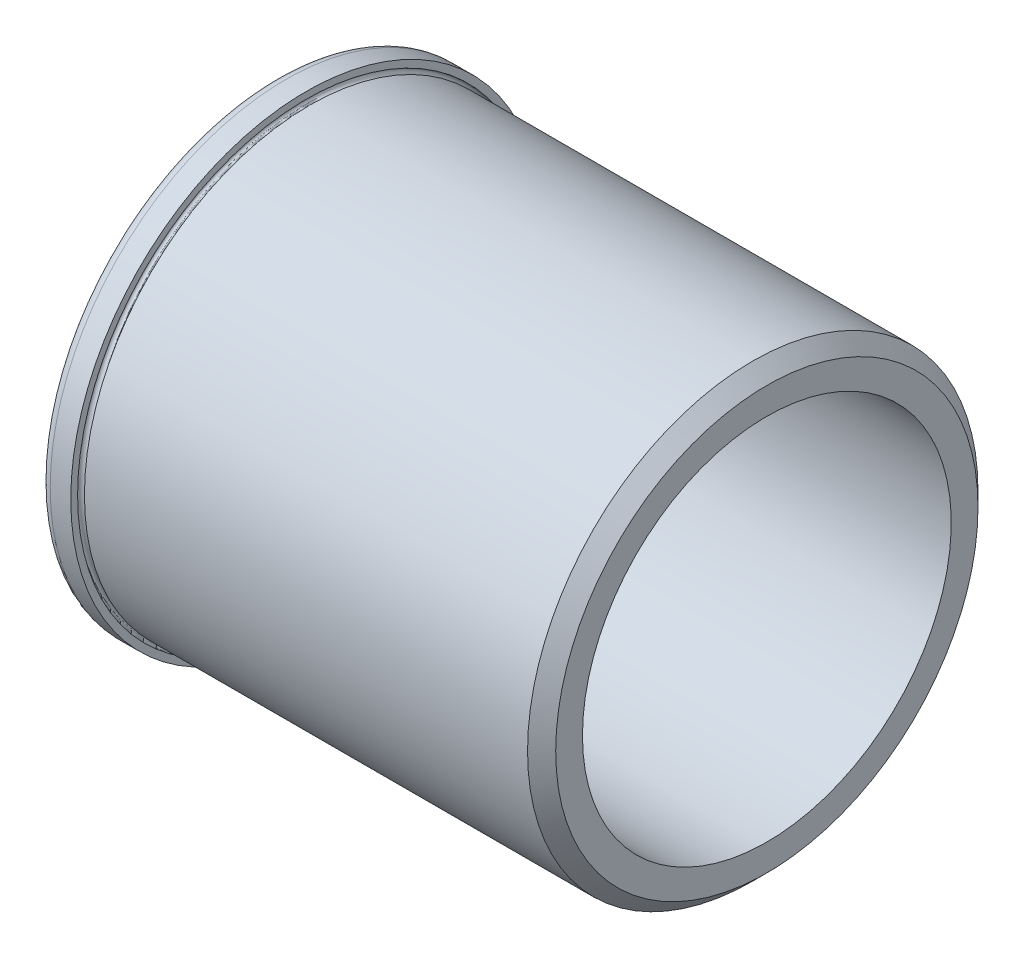
ISO-10303-21;
HEADER;
FILE_DESCRIPTION(('STEP AP214'),'2;1');
FILE_NAME('part.step','',(''),(''),'','','');
FILE_SCHEMA(('AUTOMOTIVE_DESIGN { 1 0 10303 214 1 1 1 1 }'));
ENDSEC;
DATA;
#1=APPLICATION_CONTEXT('core data for automotive mechanical design processes');
#2=APPLICATION_PROTOCOL_DEFINITION('international standard','automotive_design',2000,#1);
#3=PRODUCT_CONTEXT('',#1,'mechanical');
#4=PRODUCT('Part','Part','',(#3));
#5=PRODUCT_RELATED_PRODUCT_CATEGORY('part','',(#4));
#6=PRODUCT_DEFINITION_FORMATION('','',#4);
#7=PRODUCT_DEFINITION_CONTEXT('part definition',#1,'design');
#8=PRODUCT_DEFINITION('design','',#6,#7);
#9=PRODUCT_DEFINITION_SHAPE('','',#8);
#10=(LENGTH_UNIT() NAMED_UNIT(*) SI_UNIT(.MILLI.,.METRE.));
#11=(NAMED_UNIT(*) PLANE_ANGLE_UNIT() SI_UNIT($,.RADIAN.));
#12=(NAMED_UNIT(*) SI_UNIT($,.STERADIAN.) SOLID_ANGLE_UNIT());
#13=UNCERTAINTY_MEASURE_WITH_UNIT(LENGTH_MEASURE(1.E-05),#10,'distance_accuracy_value','');
#14=(GEOMETRIC_REPRESENTATION_CONTEXT(3) GLOBAL_UNCERTAINTY_ASSIGNED_CONTEXT((#13)) GLOBAL_UNIT_ASSIGNED_CONTEXT((#10,
#11,#12)) REPRESENTATION_CONTEXT('',''));
#15=CARTESIAN_POINT('',(0.,0.,0.));
#16=DIRECTION('',(0.,0.,1.));
#17=DIRECTION('',(1.,0.,0.));
#18=AXIS2_PLACEMENT_3D('',#15,#16,#17);
#19=CARTESIAN_POINT('',(4.7752,36.5125,0.));
#20=DIRECTION('',(1.,0.,0.));
#21=DIRECTION('',(0.,0.,-1.));
#22=AXIS2_PLACEMENT_3D('',#19,#20,#21);
#23=PLANE('',#22);
#24=CARTESIAN_POINT('',(4.7752,0.,0.));
#25=DIRECTION('',(-1.,0.,0.));
#26=DIRECTION('',(0.,0.,1.));
#27=AXIS2_PLACEMENT_3D('',#24,#25,#26);
#28=CIRCLE('',#27,35.4541666666667);
#29=CARTESIAN_POINT('',(4.7752,0.,35.4541666666667));
#30=VERTEX_POINT('',#29);
#31=EDGE_CURVE('E64',#30,#30,#28,.T.);
#32=ORIENTED_EDGE('',*,*,#31,.T.);
#33=EDGE_LOOP('',(#32));
#34=FACE_BOUND('',#33,.T.);
#35=CARTESIAN_POINT('',(4.7752,0.,0.));
#36=DIRECTION('',(-1.,0.,0.));
#37=DIRECTION('',(0.,0.,1.));
#38=AXIS2_PLACEMENT_3D('',#35,#36,#37);
#39=CIRCLE('',#38,36.5125);
#40=CARTESIAN_POINT('',(4.7752,0.,36.5125));
#41=VERTEX_POINT('',#40);
#42=EDGE_CURVE('E10',#41,#41,#39,.T.);
#43=ORIENTED_EDGE('',*,*,#42,.F.);
#44=EDGE_LOOP('',(#43));
#45=FACE_BOUND('',#44,.T.);
#46=ADVANCED_FACE('F30',(#34,#45),#23,.T.);
#47=CARTESIAN_POINT('',(0.,0.,0.));
#48=DIRECTION('',(-1.,0.,0.));
#49=DIRECTION('',(0.,0.,1.));
#50=AXIS2_PLACEMENT_3D('',#47,#48,#49);
#51=CYLINDRICAL_SURFACE('',#50,36.5125);
#52=ORIENTED_EDGE('',*,*,#42,.T.);
#53=EDGE_LOOP('',(#52));
#54=FACE_BOUND('',#53,.T.);
#55=CARTESIAN_POINT('',(1.58750000000001,0.,0.));
#56=DIRECTION('',(-1.,0.,0.));
#57=DIRECTION('',(0.,0.,1.));
#58=AXIS2_PLACEMENT_3D('',#55,#56,#57);
#59=CIRCLE('',#58,36.5125);
#60=CARTESIAN_POINT('',(1.58750000000001,0.,36.5125));
#61=VERTEX_POINT('',#60);
#62=EDGE_CURVE('E36',#61,#61,#59,.T.);
#63=ORIENTED_EDGE('',*,*,#62,.F.);
#64=EDGE_LOOP('',(#63));
#65=FACE_BOUND('',#64,.T.);
#66=ADVANCED_FACE('F82',(#54,#65),#51,.T.);
#67=CARTESIAN_POINT('',(1.5875,0.,0.));
#68=DIRECTION('',(-1.,0.,0.));
#69=DIRECTION('',(0.,0.,1.));
#70=AXIS2_PLACEMENT_3D('',#67,#68,#69);
#71=TOROIDAL_SURFACE('',#70,34.925,1.5875);
#72=CARTESIAN_POINT('',(0.,0.,0.));
#73=DIRECTION('',(-1.,0.,0.));
#74=DIRECTION('',(0.,0.,1.));
#75=AXIS2_PLACEMENT_3D('',#72,#73,#74);
#76=CIRCLE('',#75,34.925);
#77=CARTESIAN_POINT('',(0.,0.,34.925));
#78=VERTEX_POINT('',#77);
#79=EDGE_CURVE('E40',#78,#78,#76,.T.);
#80=ORIENTED_EDGE('',*,*,#79,.F.);
#81=EDGE_LOOP('',(#80));
#82=FACE_BOUND('',#81,.T.);
#83=ORIENTED_EDGE('',*,*,#62,.T.);
#84=EDGE_LOOP('',(#83));
#85=FACE_BOUND('',#84,.T.);
#86=ADVANCED_FACE('F86',(#82,#85),#71,.T.);
#87=CARTESIAN_POINT('',(0.,31.76905,0.));
#88=DIRECTION('',(-1.,0.,0.));
#89=DIRECTION('',(0.,0.,1.));
#90=AXIS2_PLACEMENT_3D('',#87,#88,#89);
#91=PLANE('',#90);
#92=ORIENTED_EDGE('',*,*,#79,.T.);
#93=EDGE_LOOP('',(#92));
#94=FACE_BOUND('',#93,.T.);
#95=CARTESIAN_POINT('',(0.,0.,0.));
#96=DIRECTION('',(-1.,0.,0.));
#97=DIRECTION('',(0.,0.,1.));
#98=AXIS2_PLACEMENT_3D('',#95,#96,#97);
#99=CIRCLE('',#98,31.76905);
#100=CARTESIAN_POINT('',(0.,0.,31.76905));
#101=VERTEX_POINT('',#100);
#102=EDGE_CURVE('E44',#101,#101,#99,.T.);
#103=ORIENTED_EDGE('',*,*,#102,.F.);
#104=EDGE_LOOP('',(#103));
#105=FACE_BOUND('',#104,.T.);
#106=ADVANCED_FACE('F90',(#94,#105),#91,.T.);
#107=CARTESIAN_POINT('',(3.175,0.,0.));
#108=DIRECTION('',(-1.,0.,0.));
#109=DIRECTION('',(0.,0.,1.));
#110=AXIS2_PLACEMENT_3D('',#107,#108,#109);
#111=TOROIDAL_SURFACE('',#110,31.76905,3.175);
#112=CARTESIAN_POINT('',(3.175,0.,0.));
#113=DIRECTION('',(-1.,0.,0.));
#114=DIRECTION('',(0.,0.,1.));
#115=AXIS2_PLACEMENT_3D('',#112,#113,#114);
#116=CIRCLE('',#115,28.59405);
#117=CARTESIAN_POINT('',(3.175,0.,28.59405));
#118=VERTEX_POINT('',#117);
#119=EDGE_CURVE('E49',#118,#118,#116,.T.);
#120=ORIENTED_EDGE('',*,*,#119,.F.);
#121=EDGE_LOOP('',(#120));
#122=FACE_BOUND('',#121,.T.);
#123=ORIENTED_EDGE('',*,*,#102,.T.);
#124=EDGE_LOOP('',(#123));
#125=FACE_BOUND('',#124,.T.);
#126=ADVANCED_FACE('F97',(#122,#125),#111,.T.);
#127=CARTESIAN_POINT('',(0.,0.,0.));
#128=DIRECTION('',(-1.,0.,0.));
#129=DIRECTION('',(0.,0.,1.));
#130=AXIS2_PLACEMENT_3D('',#127,#128,#129);
#131=CYLINDRICAL_SURFACE('',#130,28.59405);
#132=ORIENTED_EDGE('',*,*,#119,.T.);
#133=EDGE_LOOP('',(#132));
#134=FACE_BOUND('',#133,.T.);
#135=CARTESIAN_POINT('',(76.2,0.,0.));
#136=DIRECTION('',(-1.,0.,0.));
#137=DIRECTION('',(0.,0.,1.));
#138=AXIS2_PLACEMENT_3D('',#135,#136,#137);
#139=CIRCLE('',#138,28.59405);
#140=CARTESIAN_POINT('',(76.2,0.,28.59405));
#141=VERTEX_POINT('',#140);
#142=EDGE_CURVE('E52',#141,#141,#139,.T.);
#143=ORIENTED_EDGE('',*,*,#142,.F.);
#144=EDGE_LOOP('',(#143));
#145=FACE_BOUND('',#144,.T.);
#146=ADVANCED_FACE('F101',(#134,#145),#131,.F.);
#147=CARTESIAN_POINT('',(76.2,32.7421875,0.));
#148=DIRECTION('',(1.,0.,0.));
#149=DIRECTION('',(0.,0.,-1.));
#150=AXIS2_PLACEMENT_3D('',#147,#148,#149);
#151=PLANE('',#150);
#152=ORIENTED_EDGE('',*,*,#142,.T.);
#153=EDGE_LOOP('',(#152));
#154=FACE_BOUND('',#153,.T.);
#155=CARTESIAN_POINT('',(76.2,0.,0.));
#156=DIRECTION('',(-1.,0.,0.));
#157=DIRECTION('',(0.,0.,1.));
#158=AXIS2_PLACEMENT_3D('',#155,#156,#157);
#159=CIRCLE('',#158,32.7421875);
#160=CARTESIAN_POINT('',(76.2,0.,32.7421875));
#161=VERTEX_POINT('',#160);
#162=EDGE_CURVE('E55',#161,#161,#159,.T.);
#163=ORIENTED_EDGE('',*,*,#162,.F.);
#164=EDGE_LOOP('',(#163));
#165=FACE_BOUND('',#164,.T.);
#166=ADVANCED_FACE('F105',(#154,#165),#151,.T.);
#167=CARTESIAN_POINT('',(74.0171875,0.,0.));
#168=DIRECTION('',(-1.,0.,0.));
#169=DIRECTION('',(0.,0.,1.));
#170=AXIS2_PLACEMENT_3D('',#167,#168,#169);
#171=CONICAL_SURFACE('',#170,34.925,0.78539816339745);
#172=ORIENTED_EDGE('',*,*,#162,.T.);
#173=EDGE_LOOP('',(#172));
#174=FACE_BOUND('',#173,.T.);
#175=CARTESIAN_POINT('',(74.0171875,0.,0.));
#176=DIRECTION('',(-1.,0.,0.));
#177=DIRECTION('',(0.,0.,1.));
#178=AXIS2_PLACEMENT_3D('',#175,#176,#177);
#179=CIRCLE('',#178,34.925);
#180=CARTESIAN_POINT('',(74.0171875,0.,34.925));
#181=VERTEX_POINT('',#180);
#182=EDGE_CURVE('E58',#181,#181,#179,.T.);
#183=ORIENTED_EDGE('',*,*,#182,.F.);
#184=EDGE_LOOP('',(#183));
#185=FACE_BOUND('',#184,.T.);
#186=ADVANCED_FACE('F78',(#174,#185),#171,.T.);
#187=CARTESIAN_POINT('',(0.,0.,0.));
#188=DIRECTION('',(-1.,0.,0.));
#189=DIRECTION('',(0.,0.,1.));
#190=AXIS2_PLACEMENT_3D('',#187,#188,#189);
#191=CYLINDRICAL_SURFACE('',#190,34.925);
#192=ORIENTED_EDGE('',*,*,#182,.T.);
#193=EDGE_LOOP('',(#192));
#194=FACE_BOUND('',#193,.T.);
#195=CARTESIAN_POINT('',(5.30436666666667,0.,0.));
#196=DIRECTION('',(-1.,0.,0.));
#197=DIRECTION('',(0.,0.,1.));
#198=AXIS2_PLACEMENT_3D('',#195,#196,#197);
#199=CIRCLE('',#198,34.925);
#200=CARTESIAN_POINT('',(5.30436666666667,0.,34.925));
#201=VERTEX_POINT('',#200);
#202=EDGE_CURVE('E61',#201,#201,#199,.T.);
#203=ORIENTED_EDGE('',*,*,#202,.F.);
#204=EDGE_LOOP('',(#203));
#205=FACE_BOUND('',#204,.T.);
#206=ADVANCED_FACE('F72',(#194,#205),#191,.T.);
#207=CARTESIAN_POINT('',(4.7752,0.,0.));
#208=DIRECTION('',(-1.,0.,0.));
#209=DIRECTION('',(0.,0.,1.));
#210=AXIS2_PLACEMENT_3D('',#207,#208,#209);
#211=TOROIDAL_SURFACE('',#210,34.925,0.529166666666664);
#212=ORIENTED_EDGE('',*,*,#202,.T.);
#213=EDGE_LOOP('',(#212));
#214=FACE_BOUND('',#213,.T.);
#215=ORIENTED_EDGE('',*,*,#31,.F.);
#216=EDGE_LOOP('',(#215));
#217=FACE_BOUND('',#216,.T.);
#218=ADVANCED_FACE('F70',(#214,#217),#211,.F.);
#219=CLOSED_SHELL('',(#46,#66,#86,#106,#126,#146,#166,#186,#206,#218));
#220=MANIFOLD_SOLID_BREP('B2',#219);
#221=ADVANCED_BREP_SHAPE_REPRESENTATION('',(#18,#220),#14);
#222=SHAPE_DEFINITION_REPRESENTATION(#9,#221);
ENDSEC;
END-ISO-10303-21;
